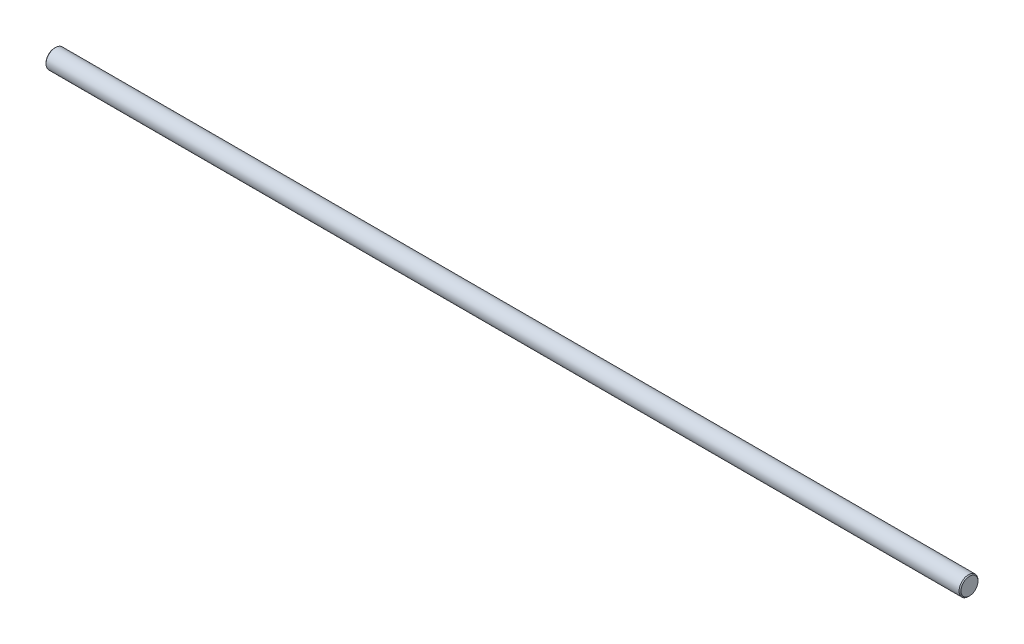
ISO-10303-21;
HEADER;
FILE_DESCRIPTION(('STEP AP214'),'2;1');
FILE_NAME('part.step','',(''),(''),'','','');
FILE_SCHEMA(('AUTOMOTIVE_DESIGN { 1 0 10303 214 1 1 1 1 }'));
ENDSEC;
DATA;
#1=APPLICATION_CONTEXT('core data for automotive mechanical design processes');
#2=APPLICATION_PROTOCOL_DEFINITION('international standard','automotive_design',2000,#1);
#3=PRODUCT_CONTEXT('',#1,'mechanical');
#4=PRODUCT('Part','Part','',(#3));
#5=PRODUCT_RELATED_PRODUCT_CATEGORY('part','',(#4));
#6=PRODUCT_DEFINITION_FORMATION('','',#4);
#7=PRODUCT_DEFINITION_CONTEXT('part definition',#1,'design');
#8=PRODUCT_DEFINITION('design','',#6,#7);
#9=PRODUCT_DEFINITION_SHAPE('','',#8);
#10=(LENGTH_UNIT() NAMED_UNIT(*) SI_UNIT(.MILLI.,.METRE.));
#11=(NAMED_UNIT(*) PLANE_ANGLE_UNIT() SI_UNIT($,.RADIAN.));
#12=(NAMED_UNIT(*) SI_UNIT($,.STERADIAN.) SOLID_ANGLE_UNIT());
#13=UNCERTAINTY_MEASURE_WITH_UNIT(LENGTH_MEASURE(1.E-05),#10,'distance_accuracy_value','');
#14=(GEOMETRIC_REPRESENTATION_CONTEXT(3) GLOBAL_UNCERTAINTY_ASSIGNED_CONTEXT((#13)) GLOBAL_UNIT_ASSIGNED_CONTEXT((#10,
#11,#12)) REPRESENTATION_CONTEXT('',''));
#15=CARTESIAN_POINT('',(0.,0.,0.));
#16=DIRECTION('',(0.,0.,1.));
#17=DIRECTION('',(1.,0.,0.));
#18=AXIS2_PLACEMENT_3D('',#15,#16,#17);
#19=CARTESIAN_POINT('',(0.,0.,0.));
#20=DIRECTION('',(1.,0.,0.));
#21=DIRECTION('',(0.,1.,0.));
#22=AXIS2_PLACEMENT_3D('',#19,#20,#21);
#23=PLANE('',#22);
#24=CARTESIAN_POINT('',(0.,0.,0.));
#25=DIRECTION('',(-1.,0.,0.));
#26=DIRECTION('',(0.,-1.,0.));
#27=AXIS2_PLACEMENT_3D('',#24,#25,#26);
#28=CIRCLE('',#27,4.5);
#29=CARTESIAN_POINT('',(0.,-4.5,0.));
#30=VERTEX_POINT('',#29);
#31=EDGE_CURVE('E10',#30,#30,#28,.T.);
#32=ORIENTED_EDGE('',*,*,#31,.T.);
#33=EDGE_LOOP('',(#32));
#34=FACE_BOUND('',#33,.T.);
#35=ADVANCED_FACE('F30',(#34),#23,.F.);
#36=CARTESIAN_POINT('',(0.5,0.,0.));
#37=DIRECTION('',(1.,0.,0.));
#38=DIRECTION('',(0.,1.,0.));
#39=AXIS2_PLACEMENT_3D('',#36,#37,#38);
#40=CONICAL_SURFACE('',#39,5.,0.785398163397447);
#41=ORIENTED_EDGE('',*,*,#31,.F.);
#42=EDGE_LOOP('',(#41));
#43=FACE_BOUND('',#42,.T.);
#44=CARTESIAN_POINT('',(0.5,0.,0.));
#45=DIRECTION('',(-1.,0.,0.));
#46=DIRECTION('',(0.,-1.,0.));
#47=AXIS2_PLACEMENT_3D('',#44,#45,#46);
#48=CIRCLE('',#47,5.);
#49=CARTESIAN_POINT('',(0.5,-5.,0.));
#50=VERTEX_POINT('',#49);
#51=EDGE_CURVE('E36',#50,#50,#48,.T.);
#52=ORIENTED_EDGE('',*,*,#51,.T.);
#53=EDGE_LOOP('',(#52));
#54=FACE_BOUND('',#53,.T.);
#55=ADVANCED_FACE('F62',(#43,#54),#40,.T.);
#56=CARTESIAN_POINT('',(483.,0.,0.));
#57=DIRECTION('',(-1.,0.,0.));
#58=DIRECTION('',(0.,-1.,0.));
#59=AXIS2_PLACEMENT_3D('',#56,#57,#58);
#60=CYLINDRICAL_SURFACE('',#59,5.00000000000003);
#61=ORIENTED_EDGE('',*,*,#51,.F.);
#62=EDGE_LOOP('',(#61));
#63=FACE_BOUND('',#62,.T.);
#64=CARTESIAN_POINT('',(482.5,0.,0.));
#65=DIRECTION('',(-1.,0.,0.));
#66=DIRECTION('',(0.,-1.,0.));
#67=AXIS2_PLACEMENT_3D('',#64,#65,#66);
#68=CIRCLE('',#67,5.00000000000006);
#69=CARTESIAN_POINT('',(482.5,-5.00000000000006,0.));
#70=VERTEX_POINT('',#69);
#71=EDGE_CURVE('E40',#70,#70,#68,.T.);
#72=ORIENTED_EDGE('',*,*,#71,.T.);
#73=EDGE_LOOP('',(#72));
#74=FACE_BOUND('',#73,.T.);
#75=ADVANCED_FACE('F58',(#63,#74),#60,.T.);
#76=CARTESIAN_POINT('',(483.,0.,0.));
#77=DIRECTION('',(-1.,0.,0.));
#78=DIRECTION('',(0.,-1.,0.));
#79=AXIS2_PLACEMENT_3D('',#76,#77,#78);
#80=CONICAL_SURFACE('',#79,4.50000000000006,0.785398163397504);
#81=ORIENTED_EDGE('',*,*,#71,.F.);
#82=EDGE_LOOP('',(#81));
#83=FACE_BOUND('',#82,.T.);
#84=CARTESIAN_POINT('',(483.,0.,0.));
#85=DIRECTION('',(-1.,0.,0.));
#86=DIRECTION('',(0.,-1.,0.));
#87=AXIS2_PLACEMENT_3D('',#84,#85,#86);
#88=CIRCLE('',#87,4.50000000000006);
#89=CARTESIAN_POINT('',(483.,-4.50000000000005,0.));
#90=VERTEX_POINT('',#89);
#91=EDGE_CURVE('E44',#90,#90,#88,.T.);
#92=ORIENTED_EDGE('',*,*,#91,.T.);
#93=EDGE_LOOP('',(#92));
#94=FACE_BOUND('',#93,.T.);
#95=ADVANCED_FACE('F50',(#83,#94),#80,.T.);
#96=CARTESIAN_POINT('',(483.,4.50000000000006,0.));
#97=DIRECTION('',(-1.,0.,0.));
#98=DIRECTION('',(0.,-1.,0.));
#99=AXIS2_PLACEMENT_3D('',#96,#97,#98);
#100=PLANE('',#99);
#101=ORIENTED_EDGE('',*,*,#91,.F.);
#102=EDGE_LOOP('',(#101));
#103=FACE_BOUND('',#102,.T.);
#104=ADVANCED_FACE('F52',(#103),#100,.F.);
#105=CLOSED_SHELL('',(#35,#55,#75,#95,#104));
#106=MANIFOLD_SOLID_BREP('B2',#105);
#107=ADVANCED_BREP_SHAPE_REPRESENTATION('',(#18,#106),#14);
#108=SHAPE_DEFINITION_REPRESENTATION(#9,#107);
ENDSEC;
END-ISO-10303-21;
